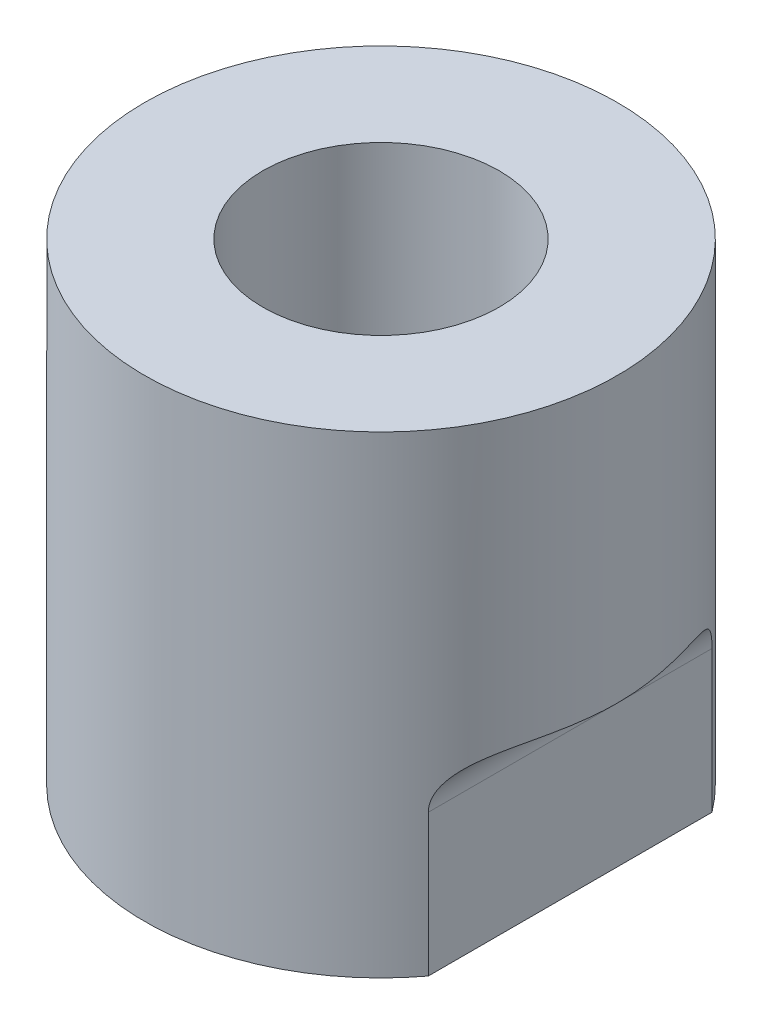
ISO-10303-21;
HEADER;
FILE_DESCRIPTION(('STEP AP214'),'2;1');
FILE_NAME('part.step','',(''),(''),'','','');
FILE_SCHEMA(('AUTOMOTIVE_DESIGN { 1 0 10303 214 1 1 1 1 }'));
ENDSEC;
DATA;
#1=APPLICATION_CONTEXT('core data for automotive mechanical design processes');
#2=APPLICATION_PROTOCOL_DEFINITION('international standard','automotive_design',2000,#1);
#3=PRODUCT_CONTEXT('',#1,'mechanical');
#4=PRODUCT('Part','Part','',(#3));
#5=PRODUCT_RELATED_PRODUCT_CATEGORY('part','',(#4));
#6=PRODUCT_DEFINITION_FORMATION('','',#4);
#7=PRODUCT_DEFINITION_CONTEXT('part definition',#1,'design');
#8=PRODUCT_DEFINITION('design','',#6,#7);
#9=PRODUCT_DEFINITION_SHAPE('','',#8);
#10=(LENGTH_UNIT() NAMED_UNIT(*) SI_UNIT(.MILLI.,.METRE.));
#11=(NAMED_UNIT(*) PLANE_ANGLE_UNIT() SI_UNIT($,.RADIAN.));
#12=(NAMED_UNIT(*) SI_UNIT($,.STERADIAN.) SOLID_ANGLE_UNIT());
#13=UNCERTAINTY_MEASURE_WITH_UNIT(LENGTH_MEASURE(1.E-05),#10,'distance_accuracy_value','');
#14=(GEOMETRIC_REPRESENTATION_CONTEXT(3) GLOBAL_UNCERTAINTY_ASSIGNED_CONTEXT((#13)) GLOBAL_UNIT_ASSIGNED_CONTEXT((#10,
#11,#12)) REPRESENTATION_CONTEXT('',''));
#15=CARTESIAN_POINT('',(0.,0.,0.));
#16=DIRECTION('',(0.,0.,1.));
#17=DIRECTION('',(1.,0.,0.));
#18=AXIS2_PLACEMENT_3D('',#15,#16,#17);
#19=CARTESIAN_POINT('',(0.,0.,0.));
#20=DIRECTION('',(0.,-1.,0.));
#21=DIRECTION('',(1.,0.,0.));
#22=AXIS2_PLACEMENT_3D('',#19,#20,#21);
#23=PLANE('',#22);
#24=DIRECTION('',(0.,0.,1.));
#25=VECTOR('',#24,1.);
#26=CARTESIAN_POINT('',(-20.,0.,-25.));
#27=LINE('',#26,#25);
#28=CARTESIAN_POINT('',(-20.,0.,-15.));
#29=VERTEX_POINT('',#28);
#30=CARTESIAN_POINT('',(-20.,0.,15.));
#31=VERTEX_POINT('',#30);
#32=EDGE_CURVE('E102',#29,#31,#27,.T.);
#33=ORIENTED_EDGE('',*,*,#32,.F.);
#34=CARTESIAN_POINT('',(0.,0.,0.));
#35=DIRECTION('',(0.,1.,0.));
#36=DIRECTION('',(-1.,0.,0.));
#37=AXIS2_PLACEMENT_3D('',#34,#35,#36);
#38=CIRCLE('',#37,25.);
#39=CARTESIAN_POINT('',(20.,0.,-15.));
#40=VERTEX_POINT('',#39);
#41=EDGE_CURVE('E107',#40,#29,#38,.T.);
#42=ORIENTED_EDGE('',*,*,#41,.F.);
#43=DIRECTION('',(0.,0.,1.));
#44=VECTOR('',#43,1.);
#45=CARTESIAN_POINT('',(20.,0.,-25.));
#46=LINE('',#45,#44);
#47=CARTESIAN_POINT('',(20.,0.,15.));
#48=VERTEX_POINT('',#47);
#49=EDGE_CURVE('E90',#40,#48,#46,.T.);
#50=ORIENTED_EDGE('',*,*,#49,.T.);
#51=EDGE_CURVE('E115',#31,#48,#38,.T.);
#52=ORIENTED_EDGE('',*,*,#51,.F.);
#53=EDGE_LOOP('',(#33,#42,#50,#52));
#54=FACE_BOUND('',#53,.T.);
#55=CARTESIAN_POINT('',(0.,0.,-7.));
#56=DIRECTION('',(0.,-1.,0.));
#57=DIRECTION('',(1.,0.,0.));
#58=AXIS2_PLACEMENT_3D('',#55,#56,#57);
#59=CIRCLE('',#58,5.40000000000002);
#60=CARTESIAN_POINT('',(5.40000000000002,0.,-7.));
#61=VERTEX_POINT('',#60);
#62=EDGE_CURVE('E129',#61,#61,#59,.F.);
#63=ORIENTED_EDGE('',*,*,#62,.T.);
#64=EDGE_LOOP('',(#63));
#65=FACE_BOUND('',#64,.T.);
#66=CARTESIAN_POINT('',(0.,0.,7.));
#67=DIRECTION('',(0.,-1.,0.));
#68=DIRECTION('',(1.,0.,0.));
#69=AXIS2_PLACEMENT_3D('',#66,#67,#68);
#70=CIRCLE('',#69,5.4);
#71=CARTESIAN_POINT('',(5.4,0.,7.));
#72=VERTEX_POINT('',#71);
#73=EDGE_CURVE('E120',#72,#72,#70,.F.);
#74=ORIENTED_EDGE('',*,*,#73,.T.);
#75=EDGE_LOOP('',(#74));
#76=FACE_BOUND('',#75,.T.);
#77=ADVANCED_FACE('F39',(#54,#65,#76),#23,.T.);
#78=CARTESIAN_POINT('',(0.,10.,0.));
#79=DIRECTION('',(0.,1.,0.));
#80=DIRECTION('',(-1.,0.,0.));
#81=AXIS2_PLACEMENT_3D('',#78,#79,#80);
#82=CYLINDRICAL_SURFACE('',#81,25.);
#83=DIRECTION('',(0.,1.,0.));
#84=VECTOR('',#83,1.);
#85=CARTESIAN_POINT('',(-20.,10.,-15.));
#86=LINE('',#85,#84);
#87=CARTESIAN_POINT('',(-20.,15.,-15.));
#88=VERTEX_POINT('',#87);
#89=EDGE_CURVE('E146',#88,#29,#86,.F.);
#90=ORIENTED_EDGE('',*,*,#89,.F.);
#91=CARTESIAN_POINT('',(-20.,15.,-15.));
#92=CARTESIAN_POINT('',(-19.9999719387438,15.0992615589307,-15.0000275706721));
#93=CARTESIAN_POINT('',(-20.0029549072185,15.1985015581573,-14.9960599198505));
#94=CARTESIAN_POINT('',(-20.014728177321,15.395930221644,-14.9803481439101));
#95=CARTESIAN_POINT('',(-20.0235132729412,15.4941197482653,-14.9686109900224));
#96=CARTESIAN_POINT('',(-20.0465625833081,15.6876615727698,-14.9377264885133));
#97=CARTESIAN_POINT('',(-20.060771921699,15.7830322994883,-14.9186533439931));
#98=CARTESIAN_POINT('',(-20.0942895923128,15.9711587427481,-14.8734770739693));
#99=CARTESIAN_POINT('',(-20.1135987310497,16.0639140430996,-14.8473728365122));
#100=CARTESIAN_POINT('',(-20.1783710593045,16.3366447054422,-14.7593575312052));
#101=CARTESIAN_POINT('',(-20.2307836860235,16.5119133920484,-14.6876063762461));
#102=CARTESIAN_POINT('',(-20.3500232281243,16.8464794664176,-14.5219487429119));
#103=CARTESIAN_POINT('',(-20.4168867046887,17.0057348141316,-14.4279860108302));
#104=CARTESIAN_POINT('',(-20.5915300791172,17.3710738521623,-14.1781741428146));
#105=CARTESIAN_POINT('',(-20.7046187233605,17.5682745373092,-14.0129992779996));
#106=CARTESIAN_POINT('',(-20.8823551946012,17.8384313454535,-13.7455058270835));
#107=CARTESIAN_POINT('',(-20.9430346431564,17.9243035508973,-13.652920838124));
#108=CARTESIAN_POINT('',(-21.0662322597882,18.0880324825631,-13.4620472476513));
#109=CARTESIAN_POINT('',(-21.12875011598,18.1658905584062,-13.3637596108674));
#110=CARTESIAN_POINT('',(-21.2921873526511,18.35800136846,-13.1026149874358));
#111=CARTESIAN_POINT('',(-21.3939077575921,18.4664781803449,-12.93601183328));
#112=CARTESIAN_POINT('',(-21.5975558107129,18.666572855815,-12.5930708048041));
#113=CARTESIAN_POINT('',(-21.6994835482361,18.7581802347809,-12.4167269643976));
#114=CARTESIAN_POINT('',(-21.9019163177168,18.9267346213783,-12.0560728311946));
#115=CARTESIAN_POINT('',(-22.0024191917393,19.00366121895,-11.8717518783712));
#116=CARTESIAN_POINT('',(-22.2006568080893,19.1446927336281,-11.4967755072729));
#117=CARTESIAN_POINT('',(-22.2983904828315,19.2087927620322,-11.3061177059416));
#118=CARTESIAN_POINT('',(-22.4833350252277,19.3217216725049,-10.9334257780778));
#119=CARTESIAN_POINT('',(-22.570799370235,19.3713134347525,-10.75174576265));
#120=CARTESIAN_POINT('',(-22.7420598852513,19.4621859647418,-10.3845922857345));
#121=CARTESIAN_POINT('',(-22.825855387518,19.503465224459,-10.1991181426407));
#122=CARTESIAN_POINT('',(-22.9894384200262,19.5788381225787,-9.82483884325262));
#123=CARTESIAN_POINT('',(-23.0692233995701,19.6129272309987,-9.63603166774524));
#124=CARTESIAN_POINT('',(-23.2244618820605,19.6748728963449,-9.25562530170297));
#125=CARTESIAN_POINT('',(-23.2999148695208,19.7027287126775,-9.0640257822799));
#126=CARTESIAN_POINT('',(-23.5200367264937,19.7784876560369,-8.48405710848106));
#127=CARTESIAN_POINT('',(-23.6578237642362,19.8183011145431,-8.09199039503227));
#128=CARTESIAN_POINT('',(-23.9139209385556,19.8823986661415,-7.30051121732836));
#129=CARTESIAN_POINT('',(-24.0322358544864,19.9066865741512,-6.90110058244606));
#130=CARTESIAN_POINT('',(-24.2121195200682,19.9380652369761,-6.23290535812218));
#131=CARTESIAN_POINT('',(-24.2793251571254,19.9481947348787,-5.96575828124672));
#132=CARTESIAN_POINT('',(-24.4048957004717,19.9648635847864,-5.42926868178371));
#133=CARTESIAN_POINT('',(-24.4632602403741,19.9714027880344,-5.15992606869744));
#134=CARTESIAN_POINT('',(-24.5710760545022,19.9818626867404,-4.6193307605998));
#135=CARTESIAN_POINT('',(-24.6205245770827,19.9857825748366,-4.34807750267379));
#136=CARTESIAN_POINT('',(-24.7104250518575,19.9918109026016,-3.8040638544766));
#137=CARTESIAN_POINT('',(-24.7508769630101,19.9939193340068,-3.53130345733582));
#138=CARTESIAN_POINT('',(-24.8222974353514,19.9969675176129,-2.98792896709111));
#139=CARTESIAN_POINT('',(-24.8533758304563,19.9979212346466,-2.71732937064049));
#140=CARTESIAN_POINT('',(-24.9066743662355,19.9991995554567,-2.17525730950293));
#141=CARTESIAN_POINT('',(-24.9288944894906,19.999524157996,-1.90378484310062));
#142=CARTESIAN_POINT('',(-24.9644424071812,19.9999069739638,-1.36040469536078));
#143=CARTESIAN_POINT('',(-24.9777749696918,19.9999653303287,-1.08849732596072));
#144=CARTESIAN_POINT('',(-24.9955545980597,19.9999991040655,-0.544393335630037));
#145=CARTESIAN_POINT('',(-25.0000016997527,19.9999745217718,-0.272196715870417));
#146=CARTESIAN_POINT('',(-25.,20.,0.));
#147=B_SPLINE_CURVE_WITH_KNOTS('',3,(#91,#92,#93,#94,#95,#96,#97,#98,#99,#100,#101,#102,#103,
#104,#105,#106,#107,#108,#109,#110,#111,#112,#113,#114,#115,#116,#117,#118,#119,#120,#121,#122,
#123,#124,#125,#126,#127,#128,#129,#130,#131,#132,#133,#134,#135,#136,#137,#138,#139,#140,#141,
#142,#143,#144,#145,#146),.UNSPECIFIED.,.F.,.F.,(4,2,2,2,2,2,2,2,2,2,2,2,2,2,2,2,2,2,2,2,2,2,2,
2,2,2,2,4),(0.,0.297625663912256,0.594984642815054,0.889411759097607,1.1838854658191,
1.77033047597793,2.35827695512631,3.19623048317435,3.61629037505126,4.03627941052149,
4.70516601620695,5.37446695265361,6.04469171694708,6.71517144532898,7.33785557905345,
7.96065257633706,8.58384078758425,9.2071030021767,10.4585110866667,11.7096115585298,
12.5364188091904,13.3632603144608,14.1903565629256,15.0174565844465,15.8344506121972,
16.651446246493,17.4680032184236,18.2845568971216),.UNSPECIFIED.);
#148=CARTESIAN_POINT('',(-25.,20.,0.));
#149=VERTEX_POINT('',#148);
#150=EDGE_CURVE('E11',#88,#149,#147,.T.);
#151=ORIENTED_EDGE('',*,*,#150,.T.);
#152=CARTESIAN_POINT('',(-25.,20.,0.));
#153=CARTESIAN_POINT('',(-24.9999999796639,19.9999968198666,0.174703280771205));
#154=CARTESIAN_POINT('',(-24.9981686550284,20.0000004208862,0.34940130105008));
#155=CARTESIAN_POINT('',(-24.9908445698413,19.9999935436467,0.69871930449906));
#156=CARTESIAN_POINT('',(-24.9853518358374,19.9999830654897,0.873339288225799));
#157=CARTESIAN_POINT('',(-24.9633834625656,19.9998890518139,1.39697938184282));
#158=CARTESIAN_POINT('',(-24.9414176519642,19.9997429386815,1.74578497362757));
#159=CARTESIAN_POINT('',(-24.882816877765,19.9987122661413,2.44296832988416));
#160=CARTESIAN_POINT('',(-24.846147859466,19.9978259872089,2.7913432046171));
#161=CARTESIAN_POINT('',(-24.7582071928976,19.9943442012766,3.48623274788493));
#162=CARTESIAN_POINT('',(-24.7069359022486,19.9917487361339,3.83274746176483));
#163=CARTESIAN_POINT('',(-24.5900483091804,19.9835090964488,4.5223317472036));
#164=CARTESIAN_POINT('',(-24.5244719796152,19.9778733540336,4.86540818670309));
#165=CARTESIAN_POINT('',(-24.3790300737654,19.9618294711543,5.54840412751728));
#166=CARTESIAN_POINT('',(-24.2991649948275,19.9514214967768,5.88832373827827));
#167=CARTESIAN_POINT('',(-24.1254579172894,19.9237082259818,6.5638204985645));
#168=CARTESIAN_POINT('',(-24.031634486543,19.9064120419938,6.89940278280218));
#169=CARTESIAN_POINT('',(-23.8302472989824,19.8623366236756,7.56573710520601));
#170=CARTESIAN_POINT('',(-23.7226871383152,19.8355598680302,7.89649038239803));
#171=CARTESIAN_POINT('',(-23.5357643709512,19.7813938559932,8.43307210518763));
#172=CARTESIAN_POINT('',(-23.4603415032621,19.7577562306984,8.64065979505617));
#173=CARTESIAN_POINT('',(-23.3042988326026,19.7044025000443,9.05307961358581));
#174=CARTESIAN_POINT('',(-23.2236794022172,19.6746868301395,9.25791193853209));
#175=CARTESIAN_POINT('',(-23.0572420711291,19.6080097064333,9.66499238288543));
#176=CARTESIAN_POINT('',(-22.9714095828061,19.5710272054411,9.86723113346986));
#177=CARTESIAN_POINT('',(-22.7951057788017,19.4886420940713,10.2679637167693));
#178=CARTESIAN_POINT('',(-22.7046341646542,19.4432389414435,10.4664573074062));
#179=CARTESIAN_POINT('',(-22.4975692008987,19.3306873039119,10.9055673194932));
#180=CARTESIAN_POINT('',(-22.3798691950488,19.2609353925921,11.1450099325421));
#181=CARTESIAN_POINT('',(-22.1393497739745,19.1033362021362,11.6154633134054));
#182=CARTESIAN_POINT('',(-22.0165279369006,19.0154802833583,11.8464699932099));
#183=CARTESIAN_POINT('',(-21.7684426078625,18.8186380068139,12.2963624090005));
#184=CARTESIAN_POINT('',(-21.6431942752653,18.7097587805638,12.5153026546029));
#185=CARTESIAN_POINT('',(-21.3928326254443,18.4668057660452,12.9385848491829));
#186=CARTESIAN_POINT('',(-21.2677193719557,18.3327683070046,13.1429472689348));
#187=CARTESIAN_POINT('',(-21.0382867735204,18.0549639107583,13.5066822617695));
#188=CARTESIAN_POINT('',(-20.9334035546394,17.9148202292164,13.6684319883176));
#189=CARTESIAN_POINT('',(-20.7313223949897,17.6099609042715,13.9730334487498));
#190=CARTESIAN_POINT('',(-20.6341298406828,17.4452282680684,14.1158719837515));
#191=CARTESIAN_POINT('',(-20.452156467203,17.0875092582611,14.3782867496508));
#192=CARTESIAN_POINT('',(-20.367550599772,16.8941879725621,14.4975415358374));
#193=CARTESIAN_POINT('',(-20.2570578143155,16.5863153323653,14.6511305820685));
#194=CARTESIAN_POINT('',(-20.2229945681641,16.4808492495607,14.6980693808262));
#195=CARTESIAN_POINT('',(-20.1612216015306,16.2644560805302,14.7826884854505));
#196=CARTESIAN_POINT('',(-20.1335093135928,16.1535312231914,14.8203725331109));
#197=CARTESIAN_POINT('',(-20.0917881019876,15.9574243567812,14.8768590457202));
#198=CARTESIAN_POINT('',(-20.0760956971843,15.8732686061873,14.8980167343731));
#199=CARTESIAN_POINT('',(-20.0489262512994,15.7030589245769,14.9345596485917));
#200=CARTESIAN_POINT('',(-20.037447880548,15.6170056014092,14.9499466950229));
#201=CARTESIAN_POINT('',(-20.0188756953709,15.4428526277043,14.9748079713543));
#202=CARTESIAN_POINT('',(-20.0118184326975,15.3547420077173,14.9842329153368));
#203=CARTESIAN_POINT('',(-20.0023694737794,15.1777586178262,14.9968405508086));
#204=CARTESIAN_POINT('',(-19.9999814583916,15.0888853020586,15.0000183175394));
#205=CARTESIAN_POINT('',(-20.,15.,15.));
#206=B_SPLINE_CURVE_WITH_KNOTS('',3,(#152,#153,#154,#155,#156,#157,#158,#159,#160,#161,#162,
#163,#164,#165,#166,#167,#168,#169,#170,#171,#172,#173,#174,#175,#176,#177,#178,#179,#180,#181,
#182,#183,#184,#185,#186,#187,#188,#189,#190,#191,#192,#193,#194,#195,#196,#197,#198,#199,#200,
#201,#202,#203,#204,#205),.UNSPECIFIED.,.F.,.F.,(4,2,2,2,2,2,2,2,2,2,2,2,2,2,2,2,2,2,2,2,2,2,2,
2,2,2,4),(0.,0.524089727119705,1.04817565425904,2.09633150291813,3.14692918232098,
4.19750113401677,5.24517422119104,6.2928108492357,7.33906613558187,8.38504808142039,
9.05128918568247,9.71748257456268,10.3856347073404,11.0538298809019,11.8804866905457,
12.7075389169449,13.5304828319593,14.3522474090389,15.0654754004306,15.7791985872934,
16.50206497509,16.8626170545644,17.2230231181399,17.4872882489399,17.7514699233633,
18.0178078679527,18.2843556873211),.UNSPECIFIED.);
#207=CARTESIAN_POINT('',(-20.,15.,15.));
#208=VERTEX_POINT('',#207);
#209=EDGE_CURVE('E54',#149,#208,#206,.T.);
#210=ORIENTED_EDGE('',*,*,#209,.T.);
#211=DIRECTION('',(0.,1.,0.));
#212=VECTOR('',#211,1.);
#213=CARTESIAN_POINT('',(-20.,10.,15.));
#214=LINE('',#213,#212);
#215=EDGE_CURVE('E142',#31,#208,#214,.T.);
#216=ORIENTED_EDGE('',*,*,#215,.F.);
#217=ORIENTED_EDGE('',*,*,#51,.T.);
#218=DIRECTION('',(0.,1.,0.));
#219=VECTOR('',#218,1.);
#220=CARTESIAN_POINT('',(20.,10.,15.));
#221=LINE('',#220,#219);
#222=CARTESIAN_POINT('',(20.,15.,15.));
#223=VERTEX_POINT('',#222);
#224=EDGE_CURVE('E96',#223,#48,#221,.F.);
#225=ORIENTED_EDGE('',*,*,#224,.F.);
#226=CARTESIAN_POINT('',(20.,15.,15.));
#227=CARTESIAN_POINT('',(19.9999719387438,15.0992615589307,15.0000275706721));
#228=CARTESIAN_POINT('',(20.0029549072185,15.1985015581573,14.9960599198505));
#229=CARTESIAN_POINT('',(20.014728177321,15.395930221644,14.9803481439101));
#230=CARTESIAN_POINT('',(20.0235132729412,15.4941197482653,14.9686109900224));
#231=CARTESIAN_POINT('',(20.0465625833081,15.6876615727698,14.9377264885133));
#232=CARTESIAN_POINT('',(20.060771921699,15.7830322994883,14.9186533439931));
#233=CARTESIAN_POINT('',(20.0942895923128,15.9711587427481,14.8734770739693));
#234=CARTESIAN_POINT('',(20.1135987310497,16.0639140430996,14.8473728365122));
#235=CARTESIAN_POINT('',(20.1783710593045,16.3366447054422,14.7593575312052));
#236=CARTESIAN_POINT('',(20.2307836860235,16.5119133920484,14.6876063762461));
#237=CARTESIAN_POINT('',(20.3500232281243,16.8464794664176,14.5219487429119));
#238=CARTESIAN_POINT('',(20.4168867046887,17.0057348141316,14.4279860108302));
#239=CARTESIAN_POINT('',(20.5915300791172,17.3710738521623,14.1781741428146));
#240=CARTESIAN_POINT('',(20.7046187233605,17.5682745373092,14.0129992779996));
#241=CARTESIAN_POINT('',(20.8823551946012,17.8384313454535,13.7455058270835));
#242=CARTESIAN_POINT('',(20.9430346431564,17.9243035508973,13.652920838124));
#243=CARTESIAN_POINT('',(21.0662322597882,18.0880324825631,13.4620472476513));
#244=CARTESIAN_POINT('',(21.12875011598,18.1658905584062,13.3637596108674));
#245=CARTESIAN_POINT('',(21.2921873526511,18.35800136846,13.1026149874358));
#246=CARTESIAN_POINT('',(21.3939077575921,18.4664781803449,12.93601183328));
#247=CARTESIAN_POINT('',(21.5975558107129,18.666572855815,12.5930708048041));
#248=CARTESIAN_POINT('',(21.6994835482361,18.7581802347809,12.4167269643976));
#249=CARTESIAN_POINT('',(21.9019163177168,18.9267346213783,12.0560728311946));
#250=CARTESIAN_POINT('',(22.0024191917393,19.00366121895,11.8717518783712));
#251=CARTESIAN_POINT('',(22.2006568080893,19.1446927336281,11.4967755072729));
#252=CARTESIAN_POINT('',(22.2983904828315,19.2087927620322,11.3061177059416));
#253=CARTESIAN_POINT('',(22.4833350252277,19.3217216725049,10.9334257780778));
#254=CARTESIAN_POINT('',(22.570799370235,19.3713134347525,10.75174576265));
#255=CARTESIAN_POINT('',(22.7420598852513,19.4621859647418,10.3845922857345));
#256=CARTESIAN_POINT('',(22.825855387518,19.503465224459,10.1991181426407));
#257=CARTESIAN_POINT('',(22.9894384200262,19.5788381225787,9.82483884325262));
#258=CARTESIAN_POINT('',(23.0692233995701,19.6129272309987,9.63603166774524));
#259=CARTESIAN_POINT('',(23.2244618820605,19.6748728963449,9.25562530170297));
#260=CARTESIAN_POINT('',(23.2999148695208,19.7027287126775,9.0640257822799));
#261=CARTESIAN_POINT('',(23.5200367264937,19.7784876560369,8.48405710848106));
#262=CARTESIAN_POINT('',(23.6578237642362,19.8183011145431,8.09199039503227));
#263=CARTESIAN_POINT('',(23.9139209385556,19.8823986661415,7.30051121732836));
#264=CARTESIAN_POINT('',(24.0322358544864,19.9066865741512,6.90110058244606));
#265=CARTESIAN_POINT('',(24.2121195200682,19.9380652369761,6.23290535812218));
#266=CARTESIAN_POINT('',(24.2793251571254,19.9481947348787,5.96575828124672));
#267=CARTESIAN_POINT('',(24.4048957004717,19.9648635847864,5.42926868178371));
#268=CARTESIAN_POINT('',(24.4632602403741,19.9714027880344,5.15992606869744));
#269=CARTESIAN_POINT('',(24.5710760545022,19.9818626867404,4.6193307605998));
#270=CARTESIAN_POINT('',(24.6205245770827,19.9857825748366,4.34807750267379));
#271=CARTESIAN_POINT('',(24.7104250518575,19.9918109026016,3.8040638544766));
#272=CARTESIAN_POINT('',(24.7508769630101,19.9939193340068,3.53130345733582));
#273=CARTESIAN_POINT('',(24.8222974353514,19.9969675176129,2.98792896709111));
#274=CARTESIAN_POINT('',(24.8533758304563,19.9979212346466,2.71732937064049));
#275=CARTESIAN_POINT('',(24.9066743662355,19.9991995554567,2.17525730950293));
#276=CARTESIAN_POINT('',(24.9288944894906,19.999524157996,1.90378484310062));
#277=CARTESIAN_POINT('',(24.9644424071812,19.9999069739638,1.36040469536078));
#278=CARTESIAN_POINT('',(24.9777749696918,19.9999653303287,1.08849732596072));
#279=CARTESIAN_POINT('',(24.9955545980597,19.9999991040655,0.544393335630037));
#280=CARTESIAN_POINT('',(25.0000016997527,19.9999745217718,0.272196715870417));
#281=CARTESIAN_POINT('',(25.,20.,0.));
#282=B_SPLINE_CURVE_WITH_KNOTS('',3,(#226,#227,#228,#229,#230,#231,#232,#233,#234,#235,#236,
#237,#238,#239,#240,#241,#242,#243,#244,#245,#246,#247,#248,#249,#250,#251,#252,#253,#254,#255,
#256,#257,#258,#259,#260,#261,#262,#263,#264,#265,#266,#267,#268,#269,#270,#271,#272,#273,#274,
#275,#276,#277,#278,#279,#280,#281),.UNSPECIFIED.,.F.,.F.,(4,2,2,2,2,2,2,2,2,2,2,2,2,2,2,2,2,2,
2,2,2,2,2,2,2,2,2,4),(0.,0.297625663912256,0.594984642815054,0.889411759097607,1.1838854658191,
1.77033047597793,2.35827695512631,3.19623048317435,3.61629037505126,4.03627941052149,
4.70516601620695,5.37446695265361,6.04469171694708,6.71517144532898,7.33785557905345,
7.96065257633706,8.58384078758425,9.2071030021767,10.4585110866667,11.7096115585298,
12.5364188091904,13.3632603144608,14.1903565629256,15.0174565844465,15.8344506121972,
16.651446246493,17.4680032184236,18.2845568971216),.UNSPECIFIED.);
#283=CARTESIAN_POINT('',(25.,20.,0.));
#284=VERTEX_POINT('',#283);
#285=EDGE_CURVE('E66',#223,#284,#282,.T.);
#286=ORIENTED_EDGE('',*,*,#285,.T.);
#287=CARTESIAN_POINT('',(25.,20.,0.));
#288=CARTESIAN_POINT('',(24.9999999796639,19.9999968198666,-0.174703280771205));
#289=CARTESIAN_POINT('',(24.9981686550284,20.0000004208862,-0.34940130105008));
#290=CARTESIAN_POINT('',(24.9908445698413,19.9999935436467,-0.69871930449906));
#291=CARTESIAN_POINT('',(24.9853518358374,19.9999830654897,-0.873339288225799));
#292=CARTESIAN_POINT('',(24.9633834625656,19.9998890518139,-1.39697938184282));
#293=CARTESIAN_POINT('',(24.9414176519642,19.9997429386815,-1.74578497362757));
#294=CARTESIAN_POINT('',(24.882816877765,19.9987122661413,-2.44296832988416));
#295=CARTESIAN_POINT('',(24.846147859466,19.9978259872089,-2.7913432046171));
#296=CARTESIAN_POINT('',(24.7582071928976,19.9943442012766,-3.48623274788493));
#297=CARTESIAN_POINT('',(24.7069359022486,19.9917487361339,-3.83274746176483));
#298=CARTESIAN_POINT('',(24.5900483091804,19.9835090964488,-4.5223317472036));
#299=CARTESIAN_POINT('',(24.5244719796152,19.9778733540336,-4.86540818670309));
#300=CARTESIAN_POINT('',(24.3790300737654,19.9618294711543,-5.54840412751728));
#301=CARTESIAN_POINT('',(24.2991649948275,19.9514214967768,-5.88832373827827));
#302=CARTESIAN_POINT('',(24.1254579172894,19.9237082259818,-6.5638204985645));
#303=CARTESIAN_POINT('',(24.031634486543,19.9064120419938,-6.89940278280218));
#304=CARTESIAN_POINT('',(23.8302472989824,19.8623366236756,-7.56573710520601));
#305=CARTESIAN_POINT('',(23.7226871383152,19.8355598680302,-7.89649038239803));
#306=CARTESIAN_POINT('',(23.5357643709512,19.7813938559932,-8.43307210518763));
#307=CARTESIAN_POINT('',(23.4603415032621,19.7577562306984,-8.64065979505617));
#308=CARTESIAN_POINT('',(23.3042988326026,19.7044025000443,-9.05307961358581));
#309=CARTESIAN_POINT('',(23.2236794022172,19.6746868301395,-9.25791193853209));
#310=CARTESIAN_POINT('',(23.0572420711291,19.6080097064333,-9.66499238288543));
#311=CARTESIAN_POINT('',(22.9714095828061,19.5710272054411,-9.86723113346986));
#312=CARTESIAN_POINT('',(22.7951057788017,19.4886420940713,-10.2679637167693));
#313=CARTESIAN_POINT('',(22.7046341646542,19.4432389414435,-10.4664573074062));
#314=CARTESIAN_POINT('',(22.4975692008987,19.3306873039119,-10.9055673194932));
#315=CARTESIAN_POINT('',(22.3798691950488,19.2609353925921,-11.1450099325421));
#316=CARTESIAN_POINT('',(22.1393497739745,19.1033362021362,-11.6154633134054));
#317=CARTESIAN_POINT('',(22.0165279369006,19.0154802833583,-11.8464699932099));
#318=CARTESIAN_POINT('',(21.7684426078625,18.8186380068139,-12.2963624090005));
#319=CARTESIAN_POINT('',(21.6431942752653,18.7097587805638,-12.5153026546029));
#320=CARTESIAN_POINT('',(21.3928326254443,18.4668057660452,-12.9385848491829));
#321=CARTESIAN_POINT('',(21.2677193719557,18.3327683070046,-13.1429472689348));
#322=CARTESIAN_POINT('',(21.0382867735204,18.0549639107583,-13.5066822617695));
#323=CARTESIAN_POINT('',(20.9334035546394,17.9148202292164,-13.6684319883176));
#324=CARTESIAN_POINT('',(20.7313223949897,17.6099609042715,-13.9730334487498));
#325=CARTESIAN_POINT('',(20.6341298406828,17.4452282680684,-14.1158719837515));
#326=CARTESIAN_POINT('',(20.452156467203,17.0875092582611,-14.3782867496508));
#327=CARTESIAN_POINT('',(20.367550599772,16.8941879725621,-14.4975415358374));
#328=CARTESIAN_POINT('',(20.2570578143155,16.5863153323653,-14.6511305820685));
#329=CARTESIAN_POINT('',(20.2229945681641,16.4808492495607,-14.6980693808262));
#330=CARTESIAN_POINT('',(20.1612216015306,16.2644560805302,-14.7826884854505));
#331=CARTESIAN_POINT('',(20.1335093135928,16.1535312231914,-14.8203725331109));
#332=CARTESIAN_POINT('',(20.0917881019876,15.9574243567812,-14.8768590457202));
#333=CARTESIAN_POINT('',(20.0760956971843,15.8732686061873,-14.8980167343731));
#334=CARTESIAN_POINT('',(20.0489262512994,15.7030589245769,-14.9345596485917));
#335=CARTESIAN_POINT('',(20.037447880548,15.6170056014092,-14.9499466950229));
#336=CARTESIAN_POINT('',(20.0188756953709,15.4428526277043,-14.9748079713543));
#337=CARTESIAN_POINT('',(20.0118184326975,15.3547420077173,-14.9842329153368));
#338=CARTESIAN_POINT('',(20.0023694737794,15.1777586178262,-14.9968405508086));
#339=CARTESIAN_POINT('',(19.9999814583916,15.0888853020586,-15.0000183175394));
#340=CARTESIAN_POINT('',(20.,15.,-15.));
#341=B_SPLINE_CURVE_WITH_KNOTS('',3,(#287,#288,#289,#290,#291,#292,#293,#294,#295,#296,#297,
#298,#299,#300,#301,#302,#303,#304,#305,#306,#307,#308,#309,#310,#311,#312,#313,#314,#315,#316,
#317,#318,#319,#320,#321,#322,#323,#324,#325,#326,#327,#328,#329,#330,#331,#332,#333,#334,#335,
#336,#337,#338,#339,#340),.UNSPECIFIED.,.F.,.F.,(4,2,2,2,2,2,2,2,2,2,2,2,2,2,2,2,2,2,2,2,2,2,2,
2,2,2,4),(0.,0.524089727119705,1.04817565425904,2.09633150291813,3.14692918232098,
4.19750113401677,5.24517422119104,6.2928108492357,7.33906613558187,8.38504808142039,
9.05128918568247,9.71748257456268,10.3856347073404,11.0538298809019,11.8804866905457,
12.7075389169449,13.5304828319593,14.3522474090389,15.0654754004306,15.7791985872934,
16.50206497509,16.8626170545644,17.2230231181399,17.4872882489399,17.7514699233633,
18.0178078679527,18.2843556873211),.UNSPECIFIED.);
#342=CARTESIAN_POINT('',(20.,15.,-15.));
#343=VERTEX_POINT('',#342);
#344=EDGE_CURVE('E108',#284,#343,#341,.T.);
#345=ORIENTED_EDGE('',*,*,#344,.T.);
#346=DIRECTION('',(0.,1.,0.));
#347=VECTOR('',#346,1.);
#348=CARTESIAN_POINT('',(20.,10.,-15.));
#349=LINE('',#348,#347);
#350=EDGE_CURVE('E94',#40,#343,#349,.T.);
#351=ORIENTED_EDGE('',*,*,#350,.F.);
#352=ORIENTED_EDGE('',*,*,#41,.T.);
#353=EDGE_LOOP('',(#90,#151,#210,#216,#217,#225,#286,#345,#351,#352));
#354=FACE_BOUND('',#353,.T.);
#355=CARTESIAN_POINT('',(0.,50.,0.));
#356=DIRECTION('',(0.,1.,0.));
#357=DIRECTION('',(-1.,0.,0.));
#358=AXIS2_PLACEMENT_3D('',#355,#356,#357);
#359=CIRCLE('',#358,25.);
#360=CARTESIAN_POINT('',(-25.,50.,0.));
#361=VERTEX_POINT('',#360);
#362=EDGE_CURVE('E116',#361,#361,#359,.T.);
#363=ORIENTED_EDGE('',*,*,#362,.F.);
#364=EDGE_LOOP('',(#363));
#365=FACE_BOUND('',#364,.T.);
#366=ADVANCED_FACE('F105',(#354,#365),#82,.T.);
#367=CARTESIAN_POINT('',(-25.,50.,0.));
#368=DIRECTION('',(0.,1.,0.));
#369=DIRECTION('',(-1.,0.,0.));
#370=AXIS2_PLACEMENT_3D('',#367,#368,#369);
#371=PLANE('',#370);
#372=ORIENTED_EDGE('',*,*,#362,.T.);
#373=EDGE_LOOP('',(#372));
#374=FACE_BOUND('',#373,.T.);
#375=CARTESIAN_POINT('',(0.,50.,0.));
#376=DIRECTION('',(0.,1.,0.));
#377=DIRECTION('',(-1.,0.,0.));
#378=AXIS2_PLACEMENT_3D('',#375,#376,#377);
#379=CIRCLE('',#378,12.5);
#380=CARTESIAN_POINT('',(-12.5,50.,0.));
#381=VERTEX_POINT('',#380);
#382=EDGE_CURVE('E122',#381,#381,#379,.T.);
#383=ORIENTED_EDGE('',*,*,#382,.F.);
#384=EDGE_LOOP('',(#383));
#385=FACE_BOUND('',#384,.T.);
#386=ADVANCED_FACE('F173',(#374,#385),#371,.T.);
#387=CARTESIAN_POINT('',(0.,10.,0.));
#388=DIRECTION('',(0.,1.,0.));
#389=DIRECTION('',(-1.,0.,0.));
#390=AXIS2_PLACEMENT_3D('',#387,#388,#389);
#391=CYLINDRICAL_SURFACE('',#390,12.5);
#392=ORIENTED_EDGE('',*,*,#382,.T.);
#393=EDGE_LOOP('',(#392));
#394=FACE_BOUND('',#393,.T.);
#395=CARTESIAN_POINT('',(0.,10.,0.));
#396=DIRECTION('',(0.,1.,0.));
#397=DIRECTION('',(-1.,0.,0.));
#398=AXIS2_PLACEMENT_3D('',#395,#396,#397);
#399=CIRCLE('',#398,12.5);
#400=CARTESIAN_POINT('',(-12.5,10.,0.));
#401=VERTEX_POINT('',#400);
#402=EDGE_CURVE('E314',#401,#401,#399,.T.);
#403=ORIENTED_EDGE('',*,*,#402,.F.);
#404=EDGE_LOOP('',(#403));
#405=FACE_BOUND('',#404,.T.);
#406=ADVANCED_FACE('F210',(#394,#405),#391,.F.);
#407=CARTESIAN_POINT('',(-12.5,10.,0.));
#408=DIRECTION('',(0.,1.,0.));
#409=DIRECTION('',(-1.,0.,0.));
#410=AXIS2_PLACEMENT_3D('',#407,#408,#409);
#411=PLANE('',#410);
#412=CARTESIAN_POINT('',(0.,10.,-7.));
#413=DIRECTION('',(0.,1.,0.));
#414=DIRECTION('',(-1.,0.,0.));
#415=AXIS2_PLACEMENT_3D('',#412,#413,#414);
#416=CIRCLE('',#415,4.9);
#417=CARTESIAN_POINT('',(-4.9,10.,-7.));
#418=VERTEX_POINT('',#417);
#419=EDGE_CURVE('E309',#418,#418,#416,.T.);
#420=ORIENTED_EDGE('',*,*,#419,.F.);
#421=EDGE_LOOP('',(#420));
#422=FACE_BOUND('',#421,.T.);
#423=CARTESIAN_POINT('',(0.,10.,7.));
#424=DIRECTION('',(0.,1.,0.));
#425=DIRECTION('',(-1.,0.,0.));
#426=AXIS2_PLACEMENT_3D('',#423,#424,#425);
#427=CIRCLE('',#426,4.9);
#428=CARTESIAN_POINT('',(-4.9,10.,7.));
#429=VERTEX_POINT('',#428);
#430=EDGE_CURVE('E306',#429,#429,#427,.T.);
#431=ORIENTED_EDGE('',*,*,#430,.F.);
#432=EDGE_LOOP('',(#431));
#433=FACE_BOUND('',#432,.T.);
#434=ORIENTED_EDGE('',*,*,#402,.T.);
#435=EDGE_LOOP('',(#434));
#436=FACE_BOUND('',#435,.T.);
#437=ADVANCED_FACE('F217',(#422,#433,#436),#411,.T.);
#438=CARTESIAN_POINT('',(0.,-13.8592929112563,7.));
#439=DIRECTION('',(0.,1.,0.));
#440=DIRECTION('',(-1.,0.,0.));
#441=AXIS2_PLACEMENT_3D('',#438,#439,#440);
#442=CYLINDRICAL_SURFACE('',#441,4.9);
#443=CARTESIAN_POINT('',(0.,0.499999999999988,7.));
#444=DIRECTION('',(0.,-1.,0.));
#445=DIRECTION('',(1.,0.,0.));
#446=AXIS2_PLACEMENT_3D('',#443,#444,#445);
#447=CIRCLE('',#446,4.9);
#448=CARTESIAN_POINT('',(4.90000000000001,0.499999999999988,7.));
#449=VERTEX_POINT('',#448);
#450=EDGE_CURVE('E110',#449,#449,#447,.T.);
#451=ORIENTED_EDGE('',*,*,#450,.T.);
#452=EDGE_LOOP('',(#451));
#453=FACE_BOUND('',#452,.T.);
#454=ORIENTED_EDGE('',*,*,#430,.T.);
#455=EDGE_LOOP('',(#454));
#456=FACE_BOUND('',#455,.T.);
#457=ADVANCED_FACE('F224',(#453,#456),#442,.F.);
#458=CARTESIAN_POINT('',(0.,-13.8592929112563,-7.));
#459=DIRECTION('',(0.,1.,0.));
#460=DIRECTION('',(-1.,0.,0.));
#461=AXIS2_PLACEMENT_3D('',#458,#459,#460);
#462=CYLINDRICAL_SURFACE('',#461,4.9);
#463=CARTESIAN_POINT('',(0.,0.500000000000007,-7.));
#464=DIRECTION('',(0.,-1.,0.));
#465=DIRECTION('',(1.,0.,0.));
#466=AXIS2_PLACEMENT_3D('',#463,#464,#465);
#467=CIRCLE('',#466,4.9);
#468=CARTESIAN_POINT('',(4.9,0.500000000000007,-7.));
#469=VERTEX_POINT('',#468);
#470=EDGE_CURVE('E133',#469,#469,#467,.T.);
#471=ORIENTED_EDGE('',*,*,#470,.T.);
#472=EDGE_LOOP('',(#471));
#473=FACE_BOUND('',#472,.T.);
#474=ORIENTED_EDGE('',*,*,#419,.T.);
#475=EDGE_LOOP('',(#474));
#476=FACE_BOUND('',#475,.T.);
#477=ADVANCED_FACE('F232',(#473,#476),#462,.F.);
#478=CARTESIAN_POINT('',(0.,0.,-7.));
#479=DIRECTION('',(0.,-1.,0.));
#480=DIRECTION('',(1.,0.,0.));
#481=AXIS2_PLACEMENT_3D('',#478,#479,#480);
#482=CONICAL_SURFACE('',#481,5.40000000000002,0.785398163397452);
#483=ORIENTED_EDGE('',*,*,#470,.F.);
#484=EDGE_LOOP('',(#483));
#485=FACE_BOUND('',#484,.T.);
#486=ORIENTED_EDGE('',*,*,#62,.F.);
#487=EDGE_LOOP('',(#486));
#488=FACE_BOUND('',#487,.T.);
#489=ADVANCED_FACE('F240',(#485,#488),#482,.F.);
#490=CARTESIAN_POINT('',(0.,0.,7.));
#491=DIRECTION('',(0.,-1.,0.));
#492=DIRECTION('',(1.,0.,0.));
#493=AXIS2_PLACEMENT_3D('',#490,#491,#492);
#494=CONICAL_SURFACE('',#493,5.4,0.785398163397452);
#495=ORIENTED_EDGE('',*,*,#450,.F.);
#496=EDGE_LOOP('',(#495));
#497=FACE_BOUND('',#496,.T.);
#498=ORIENTED_EDGE('',*,*,#73,.F.);
#499=EDGE_LOOP('',(#498));
#500=FACE_BOUND('',#499,.T.);
#501=ADVANCED_FACE('F248',(#497,#500),#494,.F.);
#502=CARTESIAN_POINT('',(20.,0.,-25.));
#503=DIRECTION('',(-1.,0.,0.));
#504=DIRECTION('',(0.,0.,1.));
#505=AXIS2_PLACEMENT_3D('',#502,#503,#504);
#506=PLANE('',#505);
#507=ORIENTED_EDGE('',*,*,#350,.T.);
#508=DIRECTION('',(0.,0.,1.));
#509=VECTOR('',#508,1.);
#510=CARTESIAN_POINT('',(20.,15.,15.));
#511=LINE('',#510,#509);
#512=EDGE_CURVE('E149',#343,#223,#511,.T.);
#513=ORIENTED_EDGE('',*,*,#512,.T.);
#514=ORIENTED_EDGE('',*,*,#224,.T.);
#515=ORIENTED_EDGE('',*,*,#49,.F.);
#516=EDGE_LOOP('',(#507,#513,#514,#515));
#517=FACE_BOUND('',#516,.T.);
#518=ADVANCED_FACE('F92',(#517),#506,.F.);
#519=CARTESIAN_POINT('',(-20.,0.,-25.));
#520=DIRECTION('',(1.,0.,0.));
#521=DIRECTION('',(0.,0.,-1.));
#522=AXIS2_PLACEMENT_3D('',#519,#520,#521);
#523=PLANE('',#522);
#524=ORIENTED_EDGE('',*,*,#215,.T.);
#525=DIRECTION('',(0.,0.,1.));
#526=VECTOR('',#525,1.);
#527=CARTESIAN_POINT('',(-20.,15.,-15.));
#528=LINE('',#527,#526);
#529=EDGE_CURVE('E152',#208,#88,#528,.F.);
#530=ORIENTED_EDGE('',*,*,#529,.T.);
#531=ORIENTED_EDGE('',*,*,#89,.T.);
#532=ORIENTED_EDGE('',*,*,#32,.T.);
#533=EDGE_LOOP('',(#524,#530,#531,#532));
#534=FACE_BOUND('',#533,.T.);
#535=ADVANCED_FACE('F189',(#534),#523,.F.);
#536=CARTESIAN_POINT('',(25.,15.,-25.));
#537=DIRECTION('',(0.,0.,-1.));
#538=DIRECTION('',(-1.,0.,0.));
#539=AXIS2_PLACEMENT_3D('',#536,#537,#538);
#540=CYLINDRICAL_SURFACE('',#539,5.);
#541=ORIENTED_EDGE('',*,*,#512,.F.);
#542=ORIENTED_EDGE('',*,*,#344,.F.);
#543=ORIENTED_EDGE('',*,*,#285,.F.);
#544=EDGE_LOOP('',(#541,#542,#543));
#545=FACE_BOUND('',#544,.T.);
#546=ADVANCED_FACE('F166',(#545),#540,.F.);
#547=CARTESIAN_POINT('',(-25.,15.,-25.));
#548=DIRECTION('',(0.,0.,-1.));
#549=DIRECTION('',(-1.,0.,0.));
#550=AXIS2_PLACEMENT_3D('',#547,#548,#549);
#551=CYLINDRICAL_SURFACE('',#550,5.);
#552=ORIENTED_EDGE('',*,*,#150,.F.);
#553=ORIENTED_EDGE('',*,*,#529,.F.);
#554=ORIENTED_EDGE('',*,*,#209,.F.);
#555=EDGE_LOOP('',(#552,#553,#554));
#556=FACE_BOUND('',#555,.T.);
#557=ADVANCED_FACE('F41',(#556),#551,.F.);
#558=CLOSED_SHELL('',(#77,#366,#386,#406,#437,#457,#477,#489,#501,#518,#535,#546,#557));
#559=MANIFOLD_SOLID_BREP('B2',#558);
#560=ADVANCED_BREP_SHAPE_REPRESENTATION('',(#18,#559),#14);
#561=SHAPE_DEFINITION_REPRESENTATION(#9,#560);
ENDSEC;
END-ISO-10303-21;
